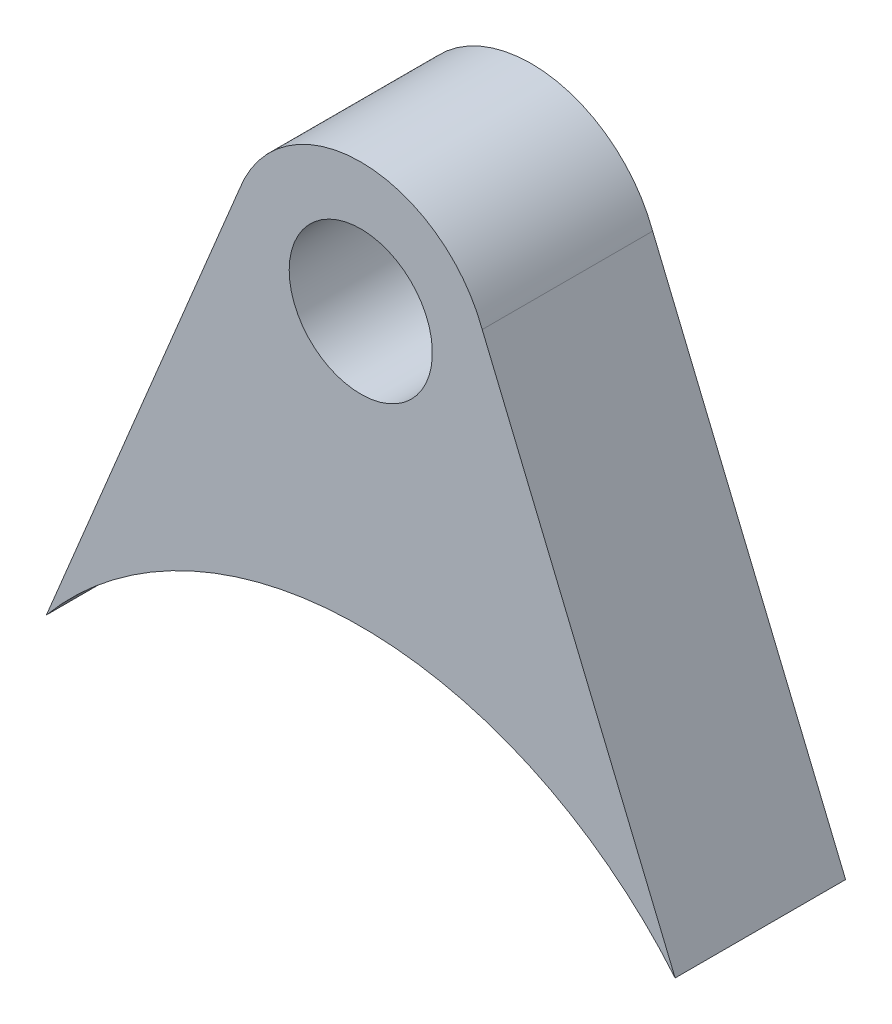
ISO-10303-21;
HEADER;
FILE_DESCRIPTION(('STEP AP214'),'2;1');
FILE_NAME('part.step','',(''),(''),'','','');
FILE_SCHEMA(('AUTOMOTIVE_DESIGN { 1 0 10303 214 1 1 1 1 }'));
ENDSEC;
DATA;
#1=APPLICATION_CONTEXT('core data for automotive mechanical design processes');
#2=APPLICATION_PROTOCOL_DEFINITION('international standard','automotive_design',2000,#1);
#3=PRODUCT_CONTEXT('',#1,'mechanical');
#4=PRODUCT('Part','Part','',(#3));
#5=PRODUCT_RELATED_PRODUCT_CATEGORY('part','',(#4));
#6=PRODUCT_DEFINITION_FORMATION('','',#4);
#7=PRODUCT_DEFINITION_CONTEXT('part definition',#1,'design');
#8=PRODUCT_DEFINITION('design','',#6,#7);
#9=PRODUCT_DEFINITION_SHAPE('','',#8);
#10=(LENGTH_UNIT() NAMED_UNIT(*) SI_UNIT(.MILLI.,.METRE.));
#11=(NAMED_UNIT(*) PLANE_ANGLE_UNIT() SI_UNIT($,.RADIAN.));
#12=(NAMED_UNIT(*) SI_UNIT($,.STERADIAN.) SOLID_ANGLE_UNIT());
#13=UNCERTAINTY_MEASURE_WITH_UNIT(LENGTH_MEASURE(1.E-05),#10,'distance_accuracy_value','');
#14=(GEOMETRIC_REPRESENTATION_CONTEXT(3) GLOBAL_UNCERTAINTY_ASSIGNED_CONTEXT((#13)) GLOBAL_UNIT_ASSIGNED_CONTEXT((#10,
#11,#12)) REPRESENTATION_CONTEXT('',''));
#15=CARTESIAN_POINT('',(0.,0.,0.));
#16=DIRECTION('',(0.,0.,1.));
#17=DIRECTION('',(1.,0.,0.));
#18=AXIS2_PLACEMENT_3D('',#15,#16,#17);
#19=CARTESIAN_POINT('',(0.,0.,31.6));
#20=DIRECTION('',(0.,0.,-1.));
#21=DIRECTION('',(-1.,0.,0.));
#22=AXIS2_PLACEMENT_3D('',#19,#20,#21);
#23=CYLINDRICAL_SURFACE('',#22,12.);
#24=CARTESIAN_POINT('',(0.,0.,26.6));
#25=DIRECTION('',(0.,0.,-1.));
#26=DIRECTION('',(-1.,0.,0.));
#27=AXIS2_PLACEMENT_3D('',#24,#25,#26);
#28=CIRCLE('',#27,12.);
#29=CARTESIAN_POINT('',(-9.22222076258302,7.67793228715796,26.6));
#30=VERTEX_POINT('',#29);
#31=CARTESIAN_POINT('',(9.22222076258302,7.67793228715796,26.6));
#32=VERTEX_POINT('',#31);
#33=EDGE_CURVE('E134',#30,#32,#28,.T.);
#34=ORIENTED_EDGE('',*,*,#33,.T.);
#35=DIRECTION('',(0.,0.,-1.));
#36=VECTOR('',#35,1.);
#37=CARTESIAN_POINT('',(9.22222076258302,7.67793228715796,31.6));
#38=LINE('',#37,#36);
#39=CARTESIAN_POINT('',(9.22222076258302,7.67793228715796,31.6));
#40=VERTEX_POINT('',#39);
#41=EDGE_CURVE('E12',#40,#32,#38,.T.);
#42=ORIENTED_EDGE('',*,*,#41,.F.);
#43=CARTESIAN_POINT('',(0.,0.,31.6));
#44=DIRECTION('',(0.,0.,-1.));
#45=DIRECTION('',(-1.,0.,0.));
#46=AXIS2_PLACEMENT_3D('',#43,#44,#45);
#47=CIRCLE('',#46,12.);
#48=CARTESIAN_POINT('',(-9.22222076258302,7.67793228715796,31.6));
#49=VERTEX_POINT('',#48);
#50=EDGE_CURVE('E136',#49,#40,#47,.T.);
#51=ORIENTED_EDGE('',*,*,#50,.F.);
#52=DIRECTION('',(0.,0.,-1.));
#53=VECTOR('',#52,1.);
#54=CARTESIAN_POINT('',(-9.22222076258302,7.67793228715796,31.6));
#55=LINE('',#54,#53);
#56=EDGE_CURVE('E121',#49,#30,#55,.T.);
#57=ORIENTED_EDGE('',*,*,#56,.T.);
#58=EDGE_LOOP('',(#34,#42,#51,#57));
#59=FACE_BOUND('',#58,.T.);
#60=ADVANCED_FACE('F75',(#59),#23,.F.);
#61=CARTESIAN_POINT('',(10.5856671270355,4.39093687820611,31.6));
#62=DIRECTION('',(-0.923687835612674,-0.383145902158922,0.));
#63=DIRECTION('',(0.383145902158922,-0.923687835612674,0.));
#64=AXIS2_PLACEMENT_3D('',#61,#62,#63);
#65=PLANE('',#64);
#66=DIRECTION('',(-0.383145902158922,0.923687835612674,0.));
#67=VECTOR('',#66,1.);
#68=CARTESIAN_POINT('',(10.5856671270355,4.39093687820611,26.6));
#69=LINE('',#68,#67);
#70=CARTESIAN_POINT('',(3.56236369177263,21.3227112033774,26.6));
#71=VERTEX_POINT('',#70);
#72=EDGE_CURVE('E115',#32,#71,#69,.T.);
#73=ORIENTED_EDGE('',*,*,#72,.T.);
#74=DIRECTION('',(0.,0.,-1.));
#75=VECTOR('',#74,1.);
#76=CARTESIAN_POINT('',(3.56236369177263,21.3227112033774,31.6));
#77=LINE('',#76,#75);
#78=CARTESIAN_POINT('',(3.56236369177263,21.3227112033774,31.6));
#79=VERTEX_POINT('',#78);
#80=EDGE_CURVE('E85',#79,#71,#77,.T.);
#81=ORIENTED_EDGE('',*,*,#80,.F.);
#82=DIRECTION('',(-0.383145902158922,0.923687835612674,0.));
#83=VECTOR('',#82,1.);
#84=CARTESIAN_POINT('',(10.5856671270355,4.39093687820611,31.6));
#85=LINE('',#84,#83);
#86=EDGE_CURVE('E93',#40,#79,#85,.T.);
#87=ORIENTED_EDGE('',*,*,#86,.F.);
#88=ORIENTED_EDGE('',*,*,#41,.T.);
#89=EDGE_LOOP('',(#73,#81,#87,#88));
#90=FACE_BOUND('',#89,.T.);
#91=ADVANCED_FACE('F166',(#90),#65,.F.);
#92=CARTESIAN_POINT('',(-10.5856671270355,4.39093687820611,31.6));
#93=DIRECTION('',(-0.923687835612674,0.383145902158922,0.));
#94=DIRECTION('',(-0.383145902158922,-0.923687835612674,0.));
#95=AXIS2_PLACEMENT_3D('',#92,#93,#94);
#96=PLANE('',#95);
#97=DIRECTION('',(0.383145902158922,0.923687835612674,0.));
#98=VECTOR('',#97,1.);
#99=CARTESIAN_POINT('',(-10.5856671270355,4.39093687820611,26.6));
#100=LINE('',#99,#98);
#101=CARTESIAN_POINT('',(-3.56236369177263,21.3227112033774,26.6));
#102=VERTEX_POINT('',#101);
#103=EDGE_CURVE('E143',#30,#102,#100,.T.);
#104=ORIENTED_EDGE('',*,*,#103,.F.);
#105=ORIENTED_EDGE('',*,*,#56,.F.);
#106=DIRECTION('',(0.383145902158922,0.923687835612674,0.));
#107=VECTOR('',#106,1.);
#108=CARTESIAN_POINT('',(-10.5856671270355,4.39093687820611,31.6));
#109=LINE('',#108,#107);
#110=CARTESIAN_POINT('',(-3.56236369177263,21.3227112033774,31.6));
#111=VERTEX_POINT('',#110);
#112=EDGE_CURVE('E133',#49,#111,#109,.T.);
#113=ORIENTED_EDGE('',*,*,#112,.T.);
#114=DIRECTION('',(0.,0.,-1.));
#115=VECTOR('',#114,1.);
#116=CARTESIAN_POINT('',(-3.56236369177263,21.3227112033774,31.6));
#117=LINE('',#116,#115);
#118=EDGE_CURVE('E124',#111,#102,#117,.T.);
#119=ORIENTED_EDGE('',*,*,#118,.T.);
#120=EDGE_LOOP('',(#104,#105,#113,#119));
#121=FACE_BOUND('',#120,.T.);
#122=ADVANCED_FACE('F135',(#121),#96,.T.);
#123=CARTESIAN_POINT('',(0.,0.,31.6));
#124=DIRECTION('',(0.,0.,-1.));
#125=DIRECTION('',(-1.,0.,0.));
#126=AXIS2_PLACEMENT_3D('',#123,#124,#125);
#127=PLANE('',#126);
#128=ORIENTED_EDGE('',*,*,#50,.T.);
#129=ORIENTED_EDGE('',*,*,#86,.T.);
#130=CARTESIAN_POINT('',(0.,20.,31.6));
#131=DIRECTION('',(0.,0.,-1.));
#132=DIRECTION('',(-1.,0.,0.));
#133=AXIS2_PLACEMENT_3D('',#130,#131,#132);
#134=CIRCLE('',#133,3.8);
#135=EDGE_CURVE('E126',#111,#79,#134,.T.);
#136=ORIENTED_EDGE('',*,*,#135,.F.);
#137=ORIENTED_EDGE('',*,*,#112,.F.);
#138=EDGE_LOOP('',(#128,#129,#136,#137));
#139=FACE_BOUND('',#138,.T.);
#140=CARTESIAN_POINT('',(0.,20.,31.6));
#141=DIRECTION('',(0.,0.,-1.));
#142=DIRECTION('',(-1.,0.,0.));
#143=AXIS2_PLACEMENT_3D('',#140,#141,#142);
#144=CIRCLE('',#143,2.1);
#145=CARTESIAN_POINT('',(-2.1,20.,31.6));
#146=VERTEX_POINT('',#145);
#147=EDGE_CURVE('E148',#146,#146,#144,.T.);
#148=ORIENTED_EDGE('',*,*,#147,.T.);
#149=EDGE_LOOP('',(#148));
#150=FACE_BOUND('',#149,.T.);
#151=ADVANCED_FACE('F131',(#139,#150),#127,.F.);
#152=CARTESIAN_POINT('',(0.,0.,26.6));
#153=DIRECTION('',(0.,0.,-1.));
#154=DIRECTION('',(-1.,0.,0.));
#155=AXIS2_PLACEMENT_3D('',#152,#153,#154);
#156=PLANE('',#155);
#157=ORIENTED_EDGE('',*,*,#33,.F.);
#158=ORIENTED_EDGE('',*,*,#103,.T.);
#159=CARTESIAN_POINT('',(0.,20.,26.6));
#160=DIRECTION('',(0.,0.,-1.));
#161=DIRECTION('',(-1.,0.,0.));
#162=AXIS2_PLACEMENT_3D('',#159,#160,#161);
#163=CIRCLE('',#162,3.8);
#164=EDGE_CURVE('E79',#102,#71,#163,.T.);
#165=ORIENTED_EDGE('',*,*,#164,.T.);
#166=ORIENTED_EDGE('',*,*,#72,.F.);
#167=EDGE_LOOP('',(#157,#158,#165,#166));
#168=FACE_BOUND('',#167,.T.);
#169=CARTESIAN_POINT('',(0.,20.,26.6));
#170=DIRECTION('',(0.,0.,-1.));
#171=DIRECTION('',(-1.,0.,0.));
#172=AXIS2_PLACEMENT_3D('',#169,#170,#171);
#173=CIRCLE('',#172,2.1);
#174=CARTESIAN_POINT('',(-2.1,20.,26.6));
#175=VERTEX_POINT('',#174);
#176=EDGE_CURVE('E151',#175,#175,#173,.T.);
#177=ORIENTED_EDGE('',*,*,#176,.F.);
#178=EDGE_LOOP('',(#177));
#179=FACE_BOUND('',#178,.T.);
#180=ADVANCED_FACE('F157',(#168,#179),#156,.T.);
#181=CARTESIAN_POINT('',(0.,20.,31.6));
#182=DIRECTION('',(0.,0.,-1.));
#183=DIRECTION('',(-1.,0.,0.));
#184=AXIS2_PLACEMENT_3D('',#181,#182,#183);
#185=CYLINDRICAL_SURFACE('',#184,3.8);
#186=ORIENTED_EDGE('',*,*,#80,.T.);
#187=ORIENTED_EDGE('',*,*,#164,.F.);
#188=ORIENTED_EDGE('',*,*,#118,.F.);
#189=ORIENTED_EDGE('',*,*,#135,.T.);
#190=EDGE_LOOP('',(#186,#187,#188,#189));
#191=FACE_BOUND('',#190,.T.);
#192=ADVANCED_FACE('F77',(#191),#185,.T.);
#193=CARTESIAN_POINT('',(0.,20.,31.6));
#194=DIRECTION('',(0.,0.,-1.));
#195=DIRECTION('',(-1.,0.,0.));
#196=AXIS2_PLACEMENT_3D('',#193,#194,#195);
#197=CYLINDRICAL_SURFACE('',#196,2.1);
#198=ORIENTED_EDGE('',*,*,#147,.F.);
#199=EDGE_LOOP('',(#198));
#200=FACE_BOUND('',#199,.T.);
#201=ORIENTED_EDGE('',*,*,#176,.T.);
#202=EDGE_LOOP('',(#201));
#203=FACE_BOUND('',#202,.T.);
#204=ADVANCED_FACE('F155',(#200,#203),#197,.F.);
#205=CLOSED_SHELL('',(#60,#91,#122,#151,#180,#192,#204));
#206=MANIFOLD_SOLID_BREP('B2',#205);
#207=ADVANCED_BREP_SHAPE_REPRESENTATION('',(#18,#206),#14);
#208=SHAPE_DEFINITION_REPRESENTATION(#9,#207);
ENDSEC;
END-ISO-10303-21;
